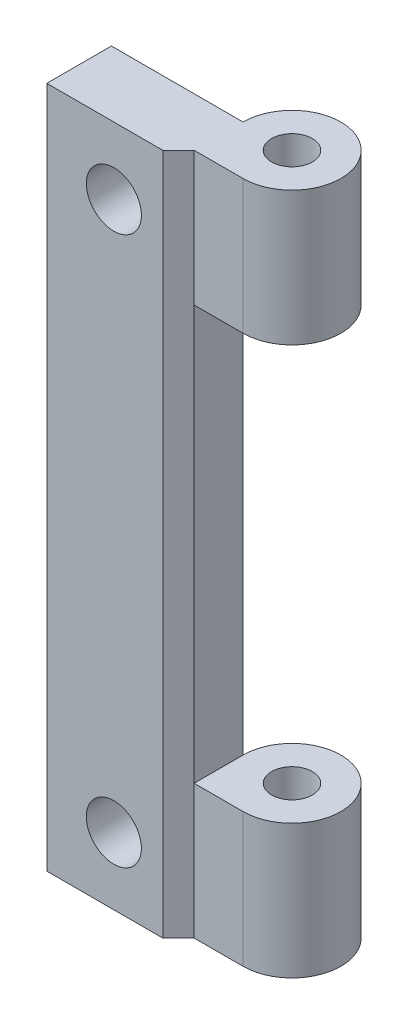
ISO-10303-21;
HEADER;
FILE_DESCRIPTION(('STEP AP214'),'2;1');
FILE_NAME('part.step','',(''),(''),'','','');
FILE_SCHEMA(('AUTOMOTIVE_DESIGN { 1 0 10303 214 1 1 1 1 }'));
ENDSEC;
DATA;
#1=APPLICATION_CONTEXT('core data for automotive mechanical design processes');
#2=APPLICATION_PROTOCOL_DEFINITION('international standard','automotive_design',2000,#1);
#3=PRODUCT_CONTEXT('',#1,'mechanical');
#4=PRODUCT('Part','Part','',(#3));
#5=PRODUCT_RELATED_PRODUCT_CATEGORY('part','',(#4));
#6=PRODUCT_DEFINITION_FORMATION('','',#4);
#7=PRODUCT_DEFINITION_CONTEXT('part definition',#1,'design');
#8=PRODUCT_DEFINITION('design','',#6,#7);
#9=PRODUCT_DEFINITION_SHAPE('','',#8);
#10=(LENGTH_UNIT() NAMED_UNIT(*) SI_UNIT(.MILLI.,.METRE.));
#11=(NAMED_UNIT(*) PLANE_ANGLE_UNIT() SI_UNIT($,.RADIAN.));
#12=(NAMED_UNIT(*) SI_UNIT($,.STERADIAN.) SOLID_ANGLE_UNIT());
#13=UNCERTAINTY_MEASURE_WITH_UNIT(LENGTH_MEASURE(1.E-05),#10,'distance_accuracy_value','');
#14=(GEOMETRIC_REPRESENTATION_CONTEXT(3) GLOBAL_UNCERTAINTY_ASSIGNED_CONTEXT((#13)) GLOBAL_UNIT_ASSIGNED_CONTEXT((#10,
#11,#12)) REPRESENTATION_CONTEXT('',''));
#15=CARTESIAN_POINT('',(0.,0.,0.));
#16=DIRECTION('',(0.,0.,1.));
#17=DIRECTION('',(1.,0.,0.));
#18=AXIS2_PLACEMENT_3D('',#15,#16,#17);
#19=CARTESIAN_POINT('',(2.404615714,6.587233714,-2.404615714));
#20=DIRECTION('',(0.,-1.,0.));
#21=DIRECTION('',(1.,0.,0.));
#22=AXIS2_PLACEMENT_3D('',#19,#20,#21);
#23=PLANE('',#22);
#24=DIRECTION('',(1.,0.,0.));
#25=VECTOR('',#24,1.);
#26=CARTESIAN_POINT('',(0.,6.587233714,2.404615714));
#27=LINE('',#26,#25);
#28=CARTESIAN_POINT('',(0.,6.587233714,2.404615714));
#29=VERTEX_POINT('',#28);
#30=CARTESIAN_POINT('',(-2.404615841,6.587233714,2.404615714));
#31=VERTEX_POINT('',#30);
#32=EDGE_CURVE('E133',#29,#31,#27,.F.);
#33=ORIENTED_EDGE('',*,*,#32,.F.);
#34=CARTESIAN_POINT('',(0.,6.587233714,0.));
#35=DIRECTION('',(0.,-1.,0.));
#36=DIRECTION('',(0.,0.,-1.));
#37=AXIS2_PLACEMENT_3D('',#34,#35,#36);
#38=CIRCLE('',#37,2.404615714);
#39=CARTESIAN_POINT('',(-2.40461584089686,6.587233714,-3.14959999990483E-05));
#40=VERTEX_POINT('',#39);
#41=EDGE_CURVE('E86',#40,#29,#38,.T.);
#42=ORIENTED_EDGE('',*,*,#41,.F.);
#43=DIRECTION('',(0.,0.,1.));
#44=VECTOR('',#43,1.);
#45=CARTESIAN_POINT('',(-2.404615968,6.587233714,-2.404615714));
#46=LINE('',#45,#44);
#47=EDGE_CURVE('E130',#40,#31,#46,.T.);
#48=ORIENTED_EDGE('',*,*,#47,.T.);
#49=EDGE_LOOP('',(#33,#42,#48));
#50=FACE_BOUND('',#49,.T.);
#51=CARTESIAN_POINT('',(0.,6.587233714,0.));
#52=DIRECTION('',(0.,-1.,0.));
#53=DIRECTION('',(0.,0.,-1.));
#54=AXIS2_PLACEMENT_3D('',#51,#52,#53);
#55=CIRCLE('',#54,1.);
#56=CARTESIAN_POINT('',(0.,6.587233714,-1.));
#57=VERTEX_POINT('',#56);
#58=EDGE_CURVE('E120',#57,#57,#55,.T.);
#59=ORIENTED_EDGE('',*,*,#58,.T.);
#60=EDGE_LOOP('',(#59));
#61=FACE_BOUND('',#60,.T.);
#62=ADVANCED_FACE('F17',(#50,#61),#23,.F.);
#63=CARTESIAN_POINT('',(-2.404615714,0.,2.404615714));
#64=DIRECTION('',(-0.707106781186544,0.,-0.707106781186551));
#65=DIRECTION('',(-0.707106781186551,0.,0.707106781186544));
#66=AXIS2_PLACEMENT_3D('',#63,#64,#65);
#67=PLANE('',#66);
#68=DIRECTION('',(0.,1.,0.));
#69=VECTOR('',#68,1.);
#70=CARTESIAN_POINT('',(-3.17496596400001,33.528,3.174965964));
#71=LINE('',#70,#69);
#72=CARTESIAN_POINT('',(-3.17496596400001,33.528,3.174965964));
#73=VERTEX_POINT('',#72);
#74=CARTESIAN_POINT('',(-3.17496596400001,0.,3.174965964));
#75=VERTEX_POINT('',#74);
#76=EDGE_CURVE('E136',#73,#75,#71,.F.);
#77=ORIENTED_EDGE('',*,*,#76,.T.);
#78=DIRECTION('',(-0.707106781186551,0.,0.707106781186544));
#79=VECTOR('',#78,1.);
#80=CARTESIAN_POINT('',(-2.404615714,0.,2.404615714));
#81=LINE('',#80,#79);
#82=CARTESIAN_POINT('',(-2.404615714,0.,2.404615714));
#83=VERTEX_POINT('',#82);
#84=EDGE_CURVE('E139',#83,#75,#81,.T.);
#85=ORIENTED_EDGE('',*,*,#84,.F.);
#86=DIRECTION('',(0.,1.,0.));
#87=VECTOR('',#86,1.);
#88=CARTESIAN_POINT('',(-2.404615714,33.528,2.404615714));
#89=LINE('',#88,#87);
#90=EDGE_CURVE('E135',#31,#83,#89,.F.);
#91=ORIENTED_EDGE('',*,*,#90,.F.);
#92=DIRECTION('',(0.,-1.,0.));
#93=VECTOR('',#92,1.);
#94=CARTESIAN_POINT('',(-2.404615968,26.940766286,2.404615714));
#95=LINE('',#94,#93);
#96=CARTESIAN_POINT('',(-2.404615841,26.940766286,2.404615714));
#97=VERTEX_POINT('',#96);
#98=EDGE_CURVE('E128',#31,#97,#95,.F.);
#99=ORIENTED_EDGE('',*,*,#98,.T.);
#100=DIRECTION('',(0.,1.,0.));
#101=VECTOR('',#100,1.);
#102=CARTESIAN_POINT('',(-2.404615714,33.528,2.404615714));
#103=LINE('',#102,#101);
#104=CARTESIAN_POINT('',(-2.404615714,33.528,2.404615714));
#105=VERTEX_POINT('',#104);
#106=EDGE_CURVE('E111',#105,#97,#103,.F.);
#107=ORIENTED_EDGE('',*,*,#106,.F.);
#108=DIRECTION('',(-0.707106781186551,0.,0.707106781186544));
#109=VECTOR('',#108,1.);
#110=CARTESIAN_POINT('',(-2.404615714,33.528,2.404615714));
#111=LINE('',#110,#109);
#112=EDGE_CURVE('E113',#73,#105,#111,.F.);
#113=ORIENTED_EDGE('',*,*,#112,.F.);
#114=EDGE_LOOP('',(#77,#85,#91,#99,#107,#113));
#115=FACE_BOUND('',#114,.T.);
#116=ADVANCED_FACE('F384',(#115),#67,.F.);
#117=CARTESIAN_POINT('',(2.404615714,26.940766286,-2.404615714));
#118=DIRECTION('',(0.,1.,0.));
#119=DIRECTION('',(-1.,0.,0.));
#120=AXIS2_PLACEMENT_3D('',#117,#118,#119);
#121=PLANE('',#120);
#122=DIRECTION('',(0.,0.,1.));
#123=VECTOR('',#122,1.);
#124=CARTESIAN_POINT('',(-2.404615968,26.940766286,-2.404615714));
#125=LINE('',#124,#123);
#126=CARTESIAN_POINT('',(-2.40461584089686,26.940766286,-3.14959983342473E-05));
#127=VERTEX_POINT('',#126);
#128=EDGE_CURVE('E98',#97,#127,#125,.F.);
#129=ORIENTED_EDGE('',*,*,#128,.T.);
#130=CARTESIAN_POINT('',(0.,26.940766286,0.));
#131=DIRECTION('',(0.,-1.,0.));
#132=DIRECTION('',(0.,0.,-1.));
#133=AXIS2_PLACEMENT_3D('',#130,#131,#132);
#134=CIRCLE('',#133,2.404615714);
#135=CARTESIAN_POINT('',(0.,26.940766286,2.404615714));
#136=VERTEX_POINT('',#135);
#137=EDGE_CURVE('E92',#136,#127,#134,.F.);
#138=ORIENTED_EDGE('',*,*,#137,.F.);
#139=DIRECTION('',(1.,0.,0.));
#140=VECTOR('',#139,1.);
#141=CARTESIAN_POINT('',(0.,26.940766286,2.404615714));
#142=LINE('',#141,#140);
#143=EDGE_CURVE('E96',#97,#136,#142,.T.);
#144=ORIENTED_EDGE('',*,*,#143,.F.);
#145=EDGE_LOOP('',(#129,#138,#144));
#146=FACE_BOUND('',#145,.T.);
#147=CARTESIAN_POINT('',(0.,26.940766286,0.));
#148=DIRECTION('',(0.,-1.,0.));
#149=DIRECTION('',(0.,0.,-1.));
#150=AXIS2_PLACEMENT_3D('',#147,#148,#149);
#151=CIRCLE('',#150,1.);
#152=CARTESIAN_POINT('',(0.,26.940766286,-1.));
#153=VERTEX_POINT('',#152);
#154=EDGE_CURVE('E20',#153,#153,#151,.F.);
#155=ORIENTED_EDGE('',*,*,#154,.T.);
#156=EDGE_LOOP('',(#155));
#157=FACE_BOUND('',#156,.T.);
#158=ADVANCED_FACE('F94',(#146,#157),#121,.F.);
#159=CARTESIAN_POINT('',(0.,33.528,2.404615714));
#160=DIRECTION('',(0.,0.,1.));
#161=DIRECTION('',(1.,0.,0.));
#162=AXIS2_PLACEMENT_3D('',#159,#160,#161);
#163=PLANE('',#162);
#164=DIRECTION('',(1.,0.,0.));
#165=VECTOR('',#164,1.);
#166=CARTESIAN_POINT('',(0.,33.528,2.404615714));
#167=LINE('',#166,#165);
#168=CARTESIAN_POINT('',(0.,33.528,2.404615714));
#169=VERTEX_POINT('',#168);
#170=EDGE_CURVE('E103',#105,#169,#167,.T.);
#171=ORIENTED_EDGE('',*,*,#170,.F.);
#172=ORIENTED_EDGE('',*,*,#106,.T.);
#173=ORIENTED_EDGE('',*,*,#143,.T.);
#174=DIRECTION('',(0.,-1.,0.));
#175=VECTOR('',#174,1.);
#176=CARTESIAN_POINT('',(0.,33.528,2.404615714));
#177=LINE('',#176,#175);
#178=EDGE_CURVE('E109',#169,#136,#177,.T.);
#179=ORIENTED_EDGE('',*,*,#178,.F.);
#180=EDGE_LOOP('',(#171,#172,#173,#179));
#181=FACE_BOUND('',#180,.T.);
#182=ADVANCED_FACE('F108',(#181),#163,.T.);
#183=CARTESIAN_POINT('',(0.,33.528,0.));
#184=DIRECTION('',(0.,-1.,0.));
#185=DIRECTION('',(0.,0.,-1.));
#186=AXIS2_PLACEMENT_3D('',#183,#184,#185);
#187=CYLINDRICAL_SURFACE('',#186,1.);
#188=CARTESIAN_POINT('',(0.,33.528,0.));
#189=DIRECTION('',(0.,-1.,0.));
#190=DIRECTION('',(0.,0.,-1.));
#191=AXIS2_PLACEMENT_3D('',#188,#189,#190);
#192=CIRCLE('',#191,1.);
#193=CARTESIAN_POINT('',(0.,33.528,-1.));
#194=VERTEX_POINT('',#193);
#195=EDGE_CURVE('E163',#194,#194,#192,.T.);
#196=ORIENTED_EDGE('',*,*,#195,.F.);
#197=EDGE_LOOP('',(#196));
#198=FACE_BOUND('',#197,.T.);
#199=ORIENTED_EDGE('',*,*,#154,.F.);
#200=EDGE_LOOP('',(#199));
#201=FACE_BOUND('',#200,.T.);
#202=ADVANCED_FACE('F360',(#198,#201),#187,.F.);
#203=CARTESIAN_POINT('',(0.,33.528,0.));
#204=DIRECTION('',(0.,-1.,0.));
#205=DIRECTION('',(0.,0.,-1.));
#206=AXIS2_PLACEMENT_3D('',#203,#204,#205);
#207=CYLINDRICAL_SURFACE('',#206,1.);
#208=CARTESIAN_POINT('',(0.,0.,0.));
#209=DIRECTION('',(0.,-1.,0.));
#210=DIRECTION('',(0.,0.,-1.));
#211=AXIS2_PLACEMENT_3D('',#208,#209,#210);
#212=CIRCLE('',#211,1.);
#213=CARTESIAN_POINT('',(0.,0.,-1.));
#214=VERTEX_POINT('',#213);
#215=EDGE_CURVE('E159',#214,#214,#212,.T.);
#216=ORIENTED_EDGE('',*,*,#215,.T.);
#217=EDGE_LOOP('',(#216));
#218=FACE_BOUND('',#217,.T.);
#219=ORIENTED_EDGE('',*,*,#58,.F.);
#220=EDGE_LOOP('',(#219));
#221=FACE_BOUND('',#220,.T.);
#222=ADVANCED_FACE('F351',(#218,#221),#207,.F.);
#223=CARTESIAN_POINT('',(0.,33.528,3.174965964));
#224=DIRECTION('',(0.,0.,-1.));
#225=DIRECTION('',(-1.,0.,0.));
#226=AXIS2_PLACEMENT_3D('',#223,#224,#225);
#227=PLANE('',#226);
#228=ORIENTED_EDGE('',*,*,#76,.F.);
#229=DIRECTION('',(1.,0.,0.));
#230=VECTOR('',#229,1.);
#231=CARTESIAN_POINT('',(0.,33.528,3.174965964));
#232=LINE('',#231,#230);
#233=CARTESIAN_POINT('',(-8.873233714,33.528,3.174965964));
#234=VERTEX_POINT('',#233);
#235=EDGE_CURVE('E167',#234,#73,#232,.T.);
#236=ORIENTED_EDGE('',*,*,#235,.F.);
#237=DIRECTION('',(0.,1.,0.));
#238=VECTOR('',#237,1.);
#239=CARTESIAN_POINT('',(-8.873233714,33.528,3.174965964));
#240=LINE('',#239,#238);
#241=CARTESIAN_POINT('',(-8.873233714,0.,3.174965964));
#242=VERTEX_POINT('',#241);
#243=EDGE_CURVE('E162',#234,#242,#240,.F.);
#244=ORIENTED_EDGE('',*,*,#243,.T.);
#245=DIRECTION('',(1.,0.,0.));
#246=VECTOR('',#245,1.);
#247=CARTESIAN_POINT('',(0.,0.,3.174965964));
#248=LINE('',#247,#246);
#249=EDGE_CURVE('E190',#242,#75,#248,.T.);
#250=ORIENTED_EDGE('',*,*,#249,.T.);
#251=EDGE_LOOP('',(#228,#236,#244,#250));
#252=FACE_BOUND('',#251,.T.);
#253=CARTESIAN_POINT('',(-5.578853714,3.29361581839627,3.174965964));
#254=DIRECTION('',(0.,0.,-1.));
#255=DIRECTION('',(-1.,0.,0.));
#256=AXIS2_PLACEMENT_3D('',#253,#254,#255);
#257=CIRCLE('',#256,1.35254999999999);
#258=CARTESIAN_POINT('',(-6.93140371399999,3.29361581839627,3.174965964));
#259=VERTEX_POINT('',#258);
#260=EDGE_CURVE('E170',#259,#259,#257,.T.);
#261=ORIENTED_EDGE('',*,*,#260,.T.);
#262=EDGE_LOOP('',(#261));
#263=FACE_BOUND('',#262,.T.);
#264=CARTESIAN_POINT('',(-5.578853714,30.2343841816037,3.174965964));
#265=DIRECTION('',(0.,0.,-1.));
#266=DIRECTION('',(-1.,0.,0.));
#267=AXIS2_PLACEMENT_3D('',#264,#265,#266);
#268=CIRCLE('',#267,1.35254999999999);
#269=CARTESIAN_POINT('',(-6.93140371399999,30.2343841816037,3.174965964));
#270=VERTEX_POINT('',#269);
#271=EDGE_CURVE('E173',#270,#270,#268,.T.);
#272=ORIENTED_EDGE('',*,*,#271,.T.);
#273=EDGE_LOOP('',(#272));
#274=FACE_BOUND('',#273,.T.);
#275=ADVANCED_FACE('F343',(#252,#263,#274),#227,.F.);
#276=CARTESIAN_POINT('',(0.,33.528,2.404615714));
#277=DIRECTION('',(0.,0.,1.));
#278=DIRECTION('',(1.,0.,0.));
#279=AXIS2_PLACEMENT_3D('',#276,#277,#278);
#280=PLANE('',#279);
#281=DIRECTION('',(1.,0.,0.));
#282=VECTOR('',#281,1.);
#283=CARTESIAN_POINT('',(0.,0.,2.404615714));
#284=LINE('',#283,#282);
#285=CARTESIAN_POINT('',(0.,0.,2.404615714));
#286=VERTEX_POINT('',#285);
#287=EDGE_CURVE('E155',#83,#286,#284,.T.);
#288=ORIENTED_EDGE('',*,*,#287,.T.);
#289=DIRECTION('',(0.,1.,0.));
#290=VECTOR('',#289,1.);
#291=CARTESIAN_POINT('',(0.,33.528,2.404615714));
#292=LINE('',#291,#290);
#293=EDGE_CURVE('E175',#286,#29,#292,.T.);
#294=ORIENTED_EDGE('',*,*,#293,.T.);
#295=ORIENTED_EDGE('',*,*,#32,.T.);
#296=ORIENTED_EDGE('',*,*,#90,.T.);
#297=EDGE_LOOP('',(#288,#294,#295,#296));
#298=FACE_BOUND('',#297,.T.);
#299=ADVANCED_FACE('F239',(#298),#280,.T.);
#300=CARTESIAN_POINT('',(-5.578853714,30.2343841816037,-3.14959999990483E-05));
#301=DIRECTION('',(0.,0.,-1.));
#302=DIRECTION('',(-1.,0.,0.));
#303=AXIS2_PLACEMENT_3D('',#300,#301,#302);
#304=CYLINDRICAL_SURFACE('',#303,1.35254999999999);
#305=ORIENTED_EDGE('',*,*,#271,.F.);
#306=EDGE_LOOP('',(#305));
#307=FACE_BOUND('',#306,.T.);
#308=CARTESIAN_POINT('',(-5.578853714,30.2343841816037,-3.14960000004379E-05));
#309=DIRECTION('',(0.,0.,-1.));
#310=DIRECTION('',(-1.,0.,0.));
#311=AXIS2_PLACEMENT_3D('',#308,#309,#310);
#312=CIRCLE('',#311,1.35254999999999);
#313=CARTESIAN_POINT('',(-6.93140371399999,30.2343841816037,-3.14960000004379E-05));
#314=VERTEX_POINT('',#313);
#315=EDGE_CURVE('E152',#314,#314,#312,.T.);
#316=ORIENTED_EDGE('',*,*,#315,.T.);
#317=EDGE_LOOP('',(#316));
#318=FACE_BOUND('',#317,.T.);
#319=ADVANCED_FACE('F256',(#307,#318),#304,.F.);
#320=CARTESIAN_POINT('',(-5.578853714,3.29361581839627,-3.14959999990483E-05));
#321=DIRECTION('',(0.,0.,-1.));
#322=DIRECTION('',(-1.,0.,0.));
#323=AXIS2_PLACEMENT_3D('',#320,#321,#322);
#324=CYLINDRICAL_SURFACE('',#323,1.35254999999999);
#325=ORIENTED_EDGE('',*,*,#260,.F.);
#326=EDGE_LOOP('',(#325));
#327=FACE_BOUND('',#326,.T.);
#328=CARTESIAN_POINT('',(-5.578853714,3.29361581839627,-3.14960000004379E-05));
#329=DIRECTION('',(0.,0.,-1.));
#330=DIRECTION('',(-1.,0.,0.));
#331=AXIS2_PLACEMENT_3D('',#328,#329,#330);
#332=CIRCLE('',#331,1.35254999999999);
#333=CARTESIAN_POINT('',(-6.93140371399999,3.29361581839627,-3.14960000004379E-05));
#334=VERTEX_POINT('',#333);
#335=EDGE_CURVE('E148',#334,#334,#332,.T.);
#336=ORIENTED_EDGE('',*,*,#335,.T.);
#337=EDGE_LOOP('',(#336));
#338=FACE_BOUND('',#337,.T.);
#339=ADVANCED_FACE('F247',(#327,#338),#324,.F.);
#340=CARTESIAN_POINT('',(0.,33.528,0.));
#341=DIRECTION('',(0.,-1.,0.));
#342=DIRECTION('',(0.,0.,-1.));
#343=AXIS2_PLACEMENT_3D('',#340,#341,#342);
#344=CYLINDRICAL_SURFACE('',#343,2.404615714);
#345=CARTESIAN_POINT('',(0.,0.,0.));
#346=DIRECTION('',(0.,-1.,0.));
#347=DIRECTION('',(0.,0.,-1.));
#348=AXIS2_PLACEMENT_3D('',#345,#346,#347);
#349=CIRCLE('',#348,2.404615714);
#350=CARTESIAN_POINT('',(-2.40461571379373,0.,-3.14959999990483E-05));
#351=VERTEX_POINT('',#350);
#352=EDGE_CURVE('E156',#286,#351,#349,.F.);
#353=ORIENTED_EDGE('',*,*,#352,.T.);
#354=DIRECTION('',(0.,1.,0.));
#355=VECTOR('',#354,1.);
#356=CARTESIAN_POINT('',(-2.40461571379373,33.528,-3.14959999990483E-05));
#357=LINE('',#356,#355);
#358=EDGE_CURVE('E151',#351,#40,#357,.T.);
#359=ORIENTED_EDGE('',*,*,#358,.T.);
#360=ORIENTED_EDGE('',*,*,#41,.T.);
#361=ORIENTED_EDGE('',*,*,#293,.F.);
#362=EDGE_LOOP('',(#353,#359,#360,#361));
#363=FACE_BOUND('',#362,.T.);
#364=ADVANCED_FACE('F244',(#363),#344,.T.);
#365=CARTESIAN_POINT('',(-2.404615968,26.940766286,-2.404615714));
#366=DIRECTION('',(-1.,0.,0.));
#367=DIRECTION('',(0.,-1.,0.));
#368=AXIS2_PLACEMENT_3D('',#365,#366,#367);
#369=PLANE('',#368);
#370=ORIENTED_EDGE('',*,*,#98,.F.);
#371=ORIENTED_EDGE('',*,*,#47,.F.);
#372=DIRECTION('',(0.,1.,0.));
#373=VECTOR('',#372,1.);
#374=CARTESIAN_POINT('',(-2.404615968,33.528,-3.14959999990483E-05));
#375=LINE('',#374,#373);
#376=EDGE_CURVE('E207',#40,#127,#375,.T.);
#377=ORIENTED_EDGE('',*,*,#376,.T.);
#378=ORIENTED_EDGE('',*,*,#128,.F.);
#379=EDGE_LOOP('',(#370,#371,#377,#378));
#380=FACE_BOUND('',#379,.T.);
#381=ADVANCED_FACE('F246',(#380),#369,.F.);
#382=CARTESIAN_POINT('',(0.,33.528,0.));
#383=DIRECTION('',(0.,-1.,0.));
#384=DIRECTION('',(0.,0.,-1.));
#385=AXIS2_PLACEMENT_3D('',#382,#383,#384);
#386=CYLINDRICAL_SURFACE('',#385,2.404615714);
#387=ORIENTED_EDGE('',*,*,#137,.T.);
#388=DIRECTION('',(0.,1.,0.));
#389=VECTOR('',#388,1.);
#390=CARTESIAN_POINT('',(-2.404615968,33.528,-3.14959999990483E-05));
#391=LINE('',#390,#389);
#392=CARTESIAN_POINT('',(-2.40461584089686,33.528,-3.14959999990483E-05));
#393=VERTEX_POINT('',#392);
#394=EDGE_CURVE('E210',#127,#393,#391,.T.);
#395=ORIENTED_EDGE('',*,*,#394,.T.);
#396=CARTESIAN_POINT('',(0.,33.528,0.));
#397=DIRECTION('',(0.,-1.,0.));
#398=DIRECTION('',(0.,0.,-1.));
#399=AXIS2_PLACEMENT_3D('',#396,#397,#398);
#400=CIRCLE('',#399,2.404615714);
#401=EDGE_CURVE('E116',#169,#393,#400,.F.);
#402=ORIENTED_EDGE('',*,*,#401,.F.);
#403=ORIENTED_EDGE('',*,*,#178,.T.);
#404=EDGE_LOOP('',(#387,#395,#402,#403));
#405=FACE_BOUND('',#404,.T.);
#406=ADVANCED_FACE('F115',(#405),#386,.T.);
#407=CARTESIAN_POINT('',(0.,33.528,0.));
#408=DIRECTION('',(0.,1.,0.));
#409=DIRECTION('',(0.,0.,1.));
#410=AXIS2_PLACEMENT_3D('',#407,#408,#409);
#411=PLANE('',#410);
#412=ORIENTED_EDGE('',*,*,#195,.T.);
#413=EDGE_LOOP('',(#412));
#414=FACE_BOUND('',#413,.T.);
#415=DIRECTION('',(0.,0.,-1.));
#416=VECTOR('',#415,1.);
#417=CARTESIAN_POINT('',(-8.873233714,33.528,3.174965964));
#418=LINE('',#417,#416);
#419=CARTESIAN_POINT('',(-8.873233714,33.528,-3.14959999990483E-05));
#420=VERTEX_POINT('',#419);
#421=EDGE_CURVE('E166',#420,#234,#418,.F.);
#422=ORIENTED_EDGE('',*,*,#421,.T.);
#423=ORIENTED_EDGE('',*,*,#235,.T.);
#424=ORIENTED_EDGE('',*,*,#112,.T.);
#425=ORIENTED_EDGE('',*,*,#170,.T.);
#426=ORIENTED_EDGE('',*,*,#401,.T.);
#427=DIRECTION('',(1.,0.,0.));
#428=VECTOR('',#427,1.);
#429=CARTESIAN_POINT('',(-8.873233714,33.528,-3.14959999990483E-05));
#430=LINE('',#429,#428);
#431=EDGE_CURVE('E212',#393,#420,#430,.F.);
#432=ORIENTED_EDGE('',*,*,#431,.T.);
#433=EDGE_LOOP('',(#422,#423,#424,#425,#426,#432));
#434=FACE_BOUND('',#433,.T.);
#435=ADVANCED_FACE('F273',(#414,#434),#411,.T.);
#436=CARTESIAN_POINT('',(-8.873233714,33.528,3.174965964));
#437=DIRECTION('',(1.,0.,0.));
#438=DIRECTION('',(0.,0.,-1.));
#439=AXIS2_PLACEMENT_3D('',#436,#437,#438);
#440=PLANE('',#439);
#441=ORIENTED_EDGE('',*,*,#243,.F.);
#442=ORIENTED_EDGE('',*,*,#421,.F.);
#443=DIRECTION('',(0.,1.,0.));
#444=VECTOR('',#443,1.);
#445=CARTESIAN_POINT('',(-8.873233714,33.528,-3.14959999990483E-05));
#446=LINE('',#445,#444);
#447=CARTESIAN_POINT('',(-8.873233714,0.,-3.14959999990483E-05));
#448=VERTEX_POINT('',#447);
#449=EDGE_CURVE('E26',#420,#448,#446,.F.);
#450=ORIENTED_EDGE('',*,*,#449,.T.);
#451=DIRECTION('',(0.,0.,1.));
#452=VECTOR('',#451,1.);
#453=CARTESIAN_POINT('',(-8.873233714,0.,0.));
#454=LINE('',#453,#452);
#455=EDGE_CURVE('E34',#448,#242,#454,.T.);
#456=ORIENTED_EDGE('',*,*,#455,.T.);
#457=EDGE_LOOP('',(#441,#442,#450,#456));
#458=FACE_BOUND('',#457,.T.);
#459=ADVANCED_FACE('F266',(#458),#440,.F.);
#460=CARTESIAN_POINT('',(0.,0.,0.));
#461=DIRECTION('',(0.,1.,0.));
#462=DIRECTION('',(0.,0.,1.));
#463=AXIS2_PLACEMENT_3D('',#460,#461,#462);
#464=PLANE('',#463);
#465=ORIENTED_EDGE('',*,*,#84,.T.);
#466=ORIENTED_EDGE('',*,*,#249,.F.);
#467=ORIENTED_EDGE('',*,*,#455,.F.);
#468=DIRECTION('',(1.,0.,0.));
#469=VECTOR('',#468,1.);
#470=CARTESIAN_POINT('',(-8.873233714,0.,-3.14959999990483E-05));
#471=LINE('',#470,#469);
#472=EDGE_CURVE('E11',#448,#351,#471,.T.);
#473=ORIENTED_EDGE('',*,*,#472,.T.);
#474=ORIENTED_EDGE('',*,*,#352,.F.);
#475=ORIENTED_EDGE('',*,*,#287,.F.);
#476=EDGE_LOOP('',(#465,#466,#467,#473,#474,#475));
#477=FACE_BOUND('',#476,.T.);
#478=ORIENTED_EDGE('',*,*,#215,.F.);
#479=EDGE_LOOP('',(#478));
#480=FACE_BOUND('',#479,.T.);
#481=ADVANCED_FACE('F242',(#477,#480),#464,.F.);
#482=CARTESIAN_POINT('',(-8.873233714,33.528,-3.14959999990483E-05));
#483=DIRECTION('',(0.,0.,1.));
#484=DIRECTION('',(1.,0.,0.));
#485=AXIS2_PLACEMENT_3D('',#482,#483,#484);
#486=PLANE('',#485);
#487=ORIENTED_EDGE('',*,*,#449,.F.);
#488=ORIENTED_EDGE('',*,*,#431,.F.);
#489=ORIENTED_EDGE('',*,*,#394,.F.);
#490=ORIENTED_EDGE('',*,*,#376,.F.);
#491=ORIENTED_EDGE('',*,*,#358,.F.);
#492=ORIENTED_EDGE('',*,*,#472,.F.);
#493=EDGE_LOOP('',(#487,#488,#489,#490,#491,#492));
#494=FACE_BOUND('',#493,.T.);
#495=ORIENTED_EDGE('',*,*,#335,.F.);
#496=EDGE_LOOP('',(#495));
#497=FACE_BOUND('',#496,.T.);
#498=ORIENTED_EDGE('',*,*,#315,.F.);
#499=EDGE_LOOP('',(#498));
#500=FACE_BOUND('',#499,.T.);
#501=ADVANCED_FACE('F259',(#494,#497,#500),#486,.F.);
#502=CLOSED_SHELL('',(#62,#116,#158,#182,#202,#222,#275,#299,#319,#339,#364,#381,#406,#435,#459,
#481,#501));
#503=MANIFOLD_SOLID_BREP('B1',#502);
#504=ADVANCED_BREP_SHAPE_REPRESENTATION('',(#18,#503),#14);
#505=SHAPE_DEFINITION_REPRESENTATION(#9,#504);
ENDSEC;
END-ISO-10303-21;
